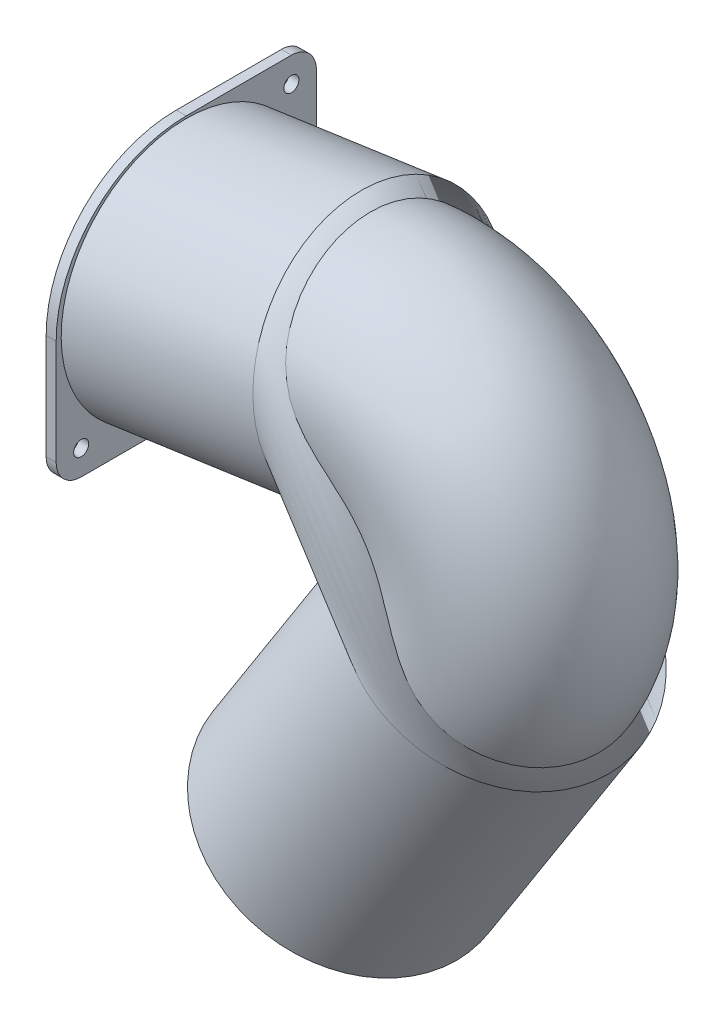
ISO-10303-21;
HEADER;
FILE_DESCRIPTION(('STEP AP214'),'2;1');
FILE_NAME('part.step','',(''),(''),'','','');
FILE_SCHEMA(('AUTOMOTIVE_DESIGN { 1 0 10303 214 1 1 1 1 }'));
ENDSEC;
DATA;
#1=APPLICATION_CONTEXT('core data for automotive mechanical design processes');
#2=APPLICATION_PROTOCOL_DEFINITION('international standard','automotive_design',2000,#1);
#3=PRODUCT_CONTEXT('',#1,'mechanical');
#4=PRODUCT('Part','Part','',(#3));
#5=PRODUCT_RELATED_PRODUCT_CATEGORY('part','',(#4));
#6=PRODUCT_DEFINITION_FORMATION('','',#4);
#7=PRODUCT_DEFINITION_CONTEXT('part definition',#1,'design');
#8=PRODUCT_DEFINITION('design','',#6,#7);
#9=PRODUCT_DEFINITION_SHAPE('','',#8);
#10=(LENGTH_UNIT() NAMED_UNIT(*) SI_UNIT(.MILLI.,.METRE.));
#11=(NAMED_UNIT(*) PLANE_ANGLE_UNIT() SI_UNIT($,.RADIAN.));
#12=(NAMED_UNIT(*) SI_UNIT($,.STERADIAN.) SOLID_ANGLE_UNIT());
#13=UNCERTAINTY_MEASURE_WITH_UNIT(LENGTH_MEASURE(1.E-05),#10,'distance_accuracy_value','');
#14=(GEOMETRIC_REPRESENTATION_CONTEXT(3) GLOBAL_UNCERTAINTY_ASSIGNED_CONTEXT((#13)) GLOBAL_UNIT_ASSIGNED_CONTEXT((#10,
#11,#12)) REPRESENTATION_CONTEXT('',''));
#15=CARTESIAN_POINT('',(0.,0.,0.));
#16=DIRECTION('',(0.,0.,1.));
#17=DIRECTION('',(1.,0.,0.));
#18=AXIS2_PLACEMENT_3D('',#15,#16,#17);
#19=CARTESIAN_POINT('',(146.924356852696,376.875600105168,0.));
#20=DIRECTION('',(0.5387217588722,0.842483748518417,0.));
#21=DIRECTION('',(-0.842483748518417,0.5387217588722,0.));
#22=AXIS2_PLACEMENT_3D('',#19,#20,#21);
#23=PLANE('',#22);
#24=CARTESIAN_POINT('',(146.924356852695,376.875600105168,0.));
#25=DIRECTION('',(0.5387217588722,0.842483748518417,0.));
#26=DIRECTION('',(-0.842483748518417,0.5387217588722,0.));
#27=AXIS2_PLACEMENT_3D('',#24,#25,#26);
#28=CIRCLE('',#27,22.);
#29=CARTESIAN_POINT('',(128.38971438529,388.727478800356,0.));
#30=VERTEX_POINT('',#29);
#31=EDGE_CURVE('E281',#30,#30,#28,.T.);
#32=ORIENTED_EDGE('',*,*,#31,.T.);
#33=EDGE_LOOP('',(#32));
#34=FACE_BOUND('',#33,.T.);
#35=CARTESIAN_POINT('',(146.924356852696,376.875600105168,0.));
#36=DIRECTION('',(0.5387217588722,0.842483748518417,0.));
#37=DIRECTION('',(-0.842483748518417,0.5387217588722,0.));
#38=AXIS2_PLACEMENT_3D('',#35,#36,#37);
#39=CIRCLE('',#38,25.);
#40=CARTESIAN_POINT('',(125.862263139735,390.343644076973,0.));
#41=VERTEX_POINT('',#40);
#42=EDGE_CURVE('E151',#41,#41,#39,.T.);
#43=ORIENTED_EDGE('',*,*,#42,.F.);
#44=EDGE_LOOP('',(#43));
#45=FACE_BOUND('',#44,.T.);
#46=ADVANCED_FACE('F48',(#34,#45),#23,.F.);
#47=CARTESIAN_POINT('',(91.6662023246358,453.640005056301,0.));
#48=DIRECTION('',(0.989712323136892,0.143071721283335,0.));
#49=DIRECTION('',(-0.143071721283335,0.989712323136892,0.));
#50=AXIS2_PLACEMENT_3D('',#47,#48,#49);
#51=CYLINDRICAL_SURFACE('',#50,25.);
#52=CARTESIAN_POINT('',(112.,456.57943640987,0.));
#53=DIRECTION('',(-0.989712323136893,-0.143071721283331,0.));
#54=DIRECTION('',(0.143071721283331,-0.989712323136893,0.));
#55=AXIS2_PLACEMENT_3D('',#52,#53,#54);
#56=CIRCLE('',#55,25.);
#57=CARTESIAN_POINT('',(114.,442.744245021113,-20.7264922077152));
#58=VERTEX_POINT('',#57);
#59=CARTESIAN_POINT('',(114.,442.744245021113,20.7264922077152));
#60=VERTEX_POINT('',#59);
#61=EDGE_CURVE('E284',#58,#60,#56,.T.);
#62=ORIENTED_EDGE('',*,*,#61,.T.);
#63=CARTESIAN_POINT('',(114.,456.868554202866,0.));
#64=DIRECTION('',(1.,0.,0.));
#65=DIRECTION('',(0.,1.,0.));
#66=AXIS2_PLACEMENT_3D('',#63,#64,#65);
#67=ELLIPSE('',#66,25.2598653321427,25.);
#68=EDGE_CURVE('E68',#60,#58,#67,.T.);
#69=ORIENTED_EDGE('',*,*,#68,.T.);
#70=EDGE_LOOP('',(#62,#69));
#71=FACE_BOUND('',#70,.T.);
#72=ADVANCED_FACE('F192',(#71),#51,.T.);
#73=CARTESIAN_POINT('',(112.,456.57943640987,0.));
#74=DIRECTION('',(0.989712323136892,0.143071721283336,0.));
#75=DIRECTION('',(-0.143071721283336,0.989712323136892,0.));
#76=AXIS2_PLACEMENT_3D('',#73,#74,#75);
#77=CYLINDRICAL_SURFACE('',#76,25.);
#78=CARTESIAN_POINT('',(152.567933597811,462.443892123981,0.));
#79=DIRECTION('',(-0.989712323136892,-0.143071721283333,0.));
#80=DIRECTION('',(0.143071721283333,-0.989712323136892,0.));
#81=AXIS2_PLACEMENT_3D('',#78,#79,#80);
#82=CIRCLE('',#81,25.);
#83=CARTESIAN_POINT('',(156.144726629894,437.701084045559,0.));
#84=VERTEX_POINT('',#83);
#85=EDGE_CURVE('E287',#84,#84,#82,.T.);
#86=ORIENTED_EDGE('',*,*,#85,.T.);
#87=EDGE_LOOP('',(#86));
#88=FACE_BOUND('',#87,.T.);
#89=ORIENTED_EDGE('',*,*,#61,.F.);
#90=CARTESIAN_POINT('',(114.,456.868554202866,0.));
#91=DIRECTION('',(1.,0.,0.));
#92=DIRECTION('',(0.,1.,0.));
#93=AXIS2_PLACEMENT_3D('',#90,#91,#92);
#94=ELLIPSE('',#93,25.2598653321427,25.);
#95=EDGE_CURVE('E271',#58,#60,#94,.T.);
#96=ORIENTED_EDGE('',*,*,#95,.T.);
#97=EDGE_LOOP('',(#89,#96));
#98=FACE_BOUND('',#97,.T.);
#99=ADVANCED_FACE('F184',(#88,#98),#77,.T.);
#100=CARTESIAN_POINT('',(156.144726629894,437.701084045559,0.));
#101=DIRECTION('',(0.,0.,-1.));
#102=DIRECTION('',(-1.,0.,0.));
#103=AXIS2_PLACEMENT_3D('',#100,#101,#102);
#104=DEGENERATE_TOROIDAL_SURFACE('',#103,25.,25.,.T.);
#105=CARTESIAN_POINT('',(177.206820342854,424.233040073754,0.));
#106=DIRECTION('',(0.5387217588722,0.842483748518417,0.));
#107=DIRECTION('',(-0.842483748518417,0.5387217588722,0.));
#108=AXIS2_PLACEMENT_3D('',#105,#106,#107);
#109=CIRCLE('',#108,25.);
#110=EDGE_CURVE('E290',#84,#84,#109,.T.);
#111=ORIENTED_EDGE('',*,*,#110,.T.);
#112=ORIENTED_EDGE('',*,*,#85,.F.);
#113=EDGE_LOOP('',(#111,#112));
#114=FACE_BOUND('',#113,.T.);
#115=ADVANCED_FACE('F179',(#114),#104,.T.);
#116=CARTESIAN_POINT('',(177.206820342855,424.233040073754,0.));
#117=DIRECTION('',(-0.538721758872197,-0.842483748518419,0.));
#118=DIRECTION('',(0.842483748518419,-0.538721758872197,0.));
#119=AXIS2_PLACEMENT_3D('',#116,#117,#118);
#120=CYLINDRICAL_SURFACE('',#119,25.);
#121=ORIENTED_EDGE('',*,*,#42,.T.);
#122=EDGE_LOOP('',(#121));
#123=FACE_BOUND('',#122,.T.);
#124=ORIENTED_EDGE('',*,*,#110,.F.);
#125=EDGE_LOOP('',(#124));
#126=FACE_BOUND('',#125,.T.);
#127=ADVANCED_FACE('F175',(#123,#126),#120,.T.);
#128=CARTESIAN_POINT('',(91.6662023246358,453.640005056301,0.));
#129=DIRECTION('',(0.989712323136892,0.143071721283335,0.));
#130=DIRECTION('',(-0.143071721283335,0.989712323136892,0.));
#131=AXIS2_PLACEMENT_3D('',#128,#129,#130);
#132=CYLINDRICAL_SURFACE('',#131,22.);
#133=CARTESIAN_POINT('',(114.,456.868554202866,0.));
#134=DIRECTION('',(1.,0.,0.));
#135=DIRECTION('',(0.,1.,0.));
#136=AXIS2_PLACEMENT_3D('',#133,#134,#135);
#137=ELLIPSE('',#136,22.2286814922856,22.);
#138=CARTESIAN_POINT('',(114.,442.744245021113,16.9878627036032));
#139=VERTEX_POINT('',#138);
#140=CARTESIAN_POINT('',(114.,442.744245021113,-16.9878627036032));
#141=VERTEX_POINT('',#140);
#142=EDGE_CURVE('E255',#139,#141,#137,.T.);
#143=ORIENTED_EDGE('',*,*,#142,.F.);
#144=CARTESIAN_POINT('',(112.,456.57943640987,0.));
#145=DIRECTION('',(0.989712323136892,0.143071721283335,0.));
#146=DIRECTION('',(-0.143071721283335,0.989712323136892,0.));
#147=AXIS2_PLACEMENT_3D('',#144,#145,#146);
#148=CIRCLE('',#147,22.);
#149=EDGE_CURVE('E149',#141,#139,#148,.F.);
#150=ORIENTED_EDGE('',*,*,#149,.F.);
#151=EDGE_LOOP('',(#143,#150));
#152=FACE_BOUND('',#151,.T.);
#153=ADVANCED_FACE('F158',(#152),#132,.F.);
#154=CARTESIAN_POINT('',(112.,456.57943640987,0.));
#155=DIRECTION('',(0.989712323136892,0.143071721283336,0.));
#156=DIRECTION('',(-0.143071721283336,0.989712323136892,0.));
#157=AXIS2_PLACEMENT_3D('',#154,#155,#156);
#158=CYLINDRICAL_SURFACE('',#157,22.);
#159=CARTESIAN_POINT('',(114.,456.868554202866,0.));
#160=DIRECTION('',(1.,0.,0.));
#161=DIRECTION('',(0.,1.,0.));
#162=AXIS2_PLACEMENT_3D('',#159,#160,#161);
#163=ELLIPSE('',#162,22.2286814922856,22.);
#164=CARTESIAN_POINT('',(114.,456.723247877266,-21.9995299554958));
#165=VERTEX_POINT('',#164);
#166=EDGE_CURVE('E12',#141,#165,#163,.T.);
#167=ORIENTED_EDGE('',*,*,#166,.F.);
#168=ORIENTED_EDGE('',*,*,#149,.T.);
#169=CARTESIAN_POINT('',(114.,456.723247877266,21.9995299554751));
#170=VERTEX_POINT('',#169);
#171=EDGE_CURVE('E56',#170,#139,#163,.T.);
#172=ORIENTED_EDGE('',*,*,#171,.F.);
#173=EDGE_CURVE('E55',#165,#170,#163,.T.);
#174=ORIENTED_EDGE('',*,*,#173,.F.);
#175=EDGE_LOOP('',(#167,#168,#172,#174));
#176=FACE_BOUND('',#175,.T.);
#177=CARTESIAN_POINT('',(152.567933597811,462.443892123981,0.));
#178=DIRECTION('',(0.989712323136892,0.143071721283336,0.));
#179=DIRECTION('',(-0.143071721283336,0.989712323136892,0.));
#180=AXIS2_PLACEMENT_3D('',#177,#178,#179);
#181=CIRCLE('',#180,22.);
#182=CARTESIAN_POINT('',(149.420355729577,484.217563232993,0.));
#183=VERTEX_POINT('',#182);
#184=EDGE_CURVE('E275',#183,#183,#181,.F.);
#185=ORIENTED_EDGE('',*,*,#184,.F.);
#186=EDGE_LOOP('',(#185));
#187=FACE_BOUND('',#186,.T.);
#188=ADVANCED_FACE('F146',(#176,#187),#158,.F.);
#189=CARTESIAN_POINT('',(156.144726629894,437.701084045559,0.));
#190=DIRECTION('',(0.,0.,-1.));
#191=DIRECTION('',(-1.,0.,0.));
#192=AXIS2_PLACEMENT_3D('',#189,#190,#191);
#193=TOROIDAL_SURFACE('',#192,25.,22.);
#194=CARTESIAN_POINT('',(177.206820342855,424.233040073754,0.));
#195=DIRECTION('',(0.5387217588722,0.842483748518417,0.));
#196=DIRECTION('',(-0.842483748518417,0.5387217588722,0.));
#197=AXIS2_PLACEMENT_3D('',#194,#195,#196);
#198=CIRCLE('',#197,22.);
#199=CARTESIAN_POINT('',(195.74146281026,412.381161378566,0.));
#200=VERTEX_POINT('',#199);
#201=EDGE_CURVE('E278',#200,#200,#198,.T.);
#202=CARTESIAN_POINT('',(156.144726629894,437.701084045559,0.));
#203=DIRECTION('',(0.,0.,-1.));
#204=DIRECTION('',(-1.,0.,0.));
#205=AXIS2_PLACEMENT_3D('',#202,#203,#204);
#206=CIRCLE('',#205,47.0000000000001);
#207=EDGE_CURVE('',#183,#200,#206,.T.);
#208=ORIENTED_EDGE('',*,*,#184,.T.);
#209=ORIENTED_EDGE('',*,*,#201,.F.);
#210=ORIENTED_EDGE('',*,*,#207,.T.);
#211=ORIENTED_EDGE('',*,*,#207,.F.);
#212=EDGE_LOOP('',(#208,#210,#209,#211));
#213=FACE_BOUND('',#212,.T.);
#214=ADVANCED_FACE('F166',(#213),#193,.F.);
#215=CARTESIAN_POINT('',(177.206820342855,424.233040073754,0.));
#216=DIRECTION('',(-0.538721758872197,-0.842483748518419,0.));
#217=DIRECTION('',(0.842483748518419,-0.538721758872197,0.));
#218=AXIS2_PLACEMENT_3D('',#215,#216,#217);
#219=CYLINDRICAL_SURFACE('',#218,22.);
#220=ORIENTED_EDGE('',*,*,#31,.F.);
#221=EDGE_LOOP('',(#220));
#222=FACE_BOUND('',#221,.T.);
#223=ORIENTED_EDGE('',*,*,#201,.T.);
#224=EDGE_LOOP('',(#223));
#225=FACE_BOUND('',#224,.T.);
#226=ADVANCED_FACE('F155',(#222,#225),#219,.F.);
#227=CARTESIAN_POINT('',(114.,456.57943640987,0.));
#228=DIRECTION('',(1.,0.,0.));
#229=DIRECTION('',(0.,0.,-1.));
#230=AXIS2_PLACEMENT_3D('',#227,#228,#229);
#231=PLANE('',#230);
#232=ORIENTED_EDGE('',*,*,#173,.T.);
#233=CARTESIAN_POINT('',(114.,456.57943640987,0.));
#234=DIRECTION('',(-1.,0.,0.));
#235=DIRECTION('',(0.,0.,1.));
#236=AXIS2_PLACEMENT_3D('',#233,#234,#235);
#237=CIRCLE('',#236,22.);
#238=EDGE_CURVE('E136',#170,#165,#237,.T.);
#239=ORIENTED_EDGE('',*,*,#238,.T.);
#240=EDGE_LOOP('',(#232,#239));
#241=FACE_BOUND('',#240,.T.);
#242=ADVANCED_FACE('F152',(#241),#231,.T.);
#243=CARTESIAN_POINT('',(114.,456.57943640987,0.));
#244=DIRECTION('',(-1.,0.,0.));
#245=DIRECTION('',(0.,0.,1.));
#246=AXIS2_PLACEMENT_3D('',#243,#244,#245);
#247=CYLINDRICAL_SURFACE('',#246,26.);
#248=CARTESIAN_POINT('',(112.,456.57943640987,0.));
#249=DIRECTION('',(-1.,0.,0.));
#250=DIRECTION('',(0.,0.,-1.));
#251=AXIS2_PLACEMENT_3D('',#248,#249,#250);
#252=CIRCLE('',#251,26.);
#253=CARTESIAN_POINT('',(112.,456.57943640987,-26.));
#254=VERTEX_POINT('',#253);
#255=CARTESIAN_POINT('',(112.,430.57943640987,0.));
#256=VERTEX_POINT('',#255);
#257=EDGE_CURVE('E493',#254,#256,#252,.T.);
#258=ORIENTED_EDGE('',*,*,#257,.F.);
#259=DIRECTION('',(-1.,0.,0.));
#260=VECTOR('',#259,1.);
#261=CARTESIAN_POINT('',(114.,456.57943640987,-26.));
#262=LINE('',#261,#260);
#263=CARTESIAN_POINT('',(114.,456.57943640987,-26.));
#264=VERTEX_POINT('',#263);
#265=EDGE_CURVE('E239',#264,#254,#262,.T.);
#266=ORIENTED_EDGE('',*,*,#265,.F.);
#267=CARTESIAN_POINT('',(114.,456.57943640987,0.));
#268=DIRECTION('',(-1.,0.,0.));
#269=DIRECTION('',(0.,0.,-1.));
#270=AXIS2_PLACEMENT_3D('',#267,#268,#269);
#271=CIRCLE('',#270,26.);
#272=CARTESIAN_POINT('',(114.,430.57943640987,0.));
#273=VERTEX_POINT('',#272);
#274=EDGE_CURVE('E244',#264,#273,#271,.T.);
#275=ORIENTED_EDGE('',*,*,#274,.T.);
#276=DIRECTION('',(-1.,0.,0.));
#277=VECTOR('',#276,1.);
#278=CARTESIAN_POINT('',(114.,430.57943640987,0.));
#279=LINE('',#278,#277);
#280=EDGE_CURVE('E267',#273,#256,#279,.T.);
#281=ORIENTED_EDGE('',*,*,#280,.T.);
#282=EDGE_LOOP('',(#258,#266,#275,#281));
#283=FACE_BOUND('',#282,.T.);
#284=ADVANCED_FACE('F154',(#283),#247,.T.);
#285=CARTESIAN_POINT('',(114.,456.57943640987,-26.));
#286=DIRECTION('',(0.,0.,-1.));
#287=DIRECTION('',(-1.,0.,0.));
#288=AXIS2_PLACEMENT_3D('',#285,#286,#287);
#289=PLANE('',#288);
#290=DIRECTION('',(0.,-1.,0.));
#291=VECTOR('',#290,1.);
#292=CARTESIAN_POINT('',(112.,456.57943640987,-26.));
#293=LINE('',#292,#291);
#294=CARTESIAN_POINT('',(112.,477.57943640987,-26.));
#295=VERTEX_POINT('',#294);
#296=EDGE_CURVE('E235',#295,#254,#293,.T.);
#297=ORIENTED_EDGE('',*,*,#296,.F.);
#298=DIRECTION('',(-1.,0.,0.));
#299=VECTOR('',#298,1.);
#300=CARTESIAN_POINT('',(114.,477.57943640987,-26.));
#301=LINE('',#300,#299);
#302=CARTESIAN_POINT('',(114.,477.57943640987,-26.));
#303=VERTEX_POINT('',#302);
#304=EDGE_CURVE('E237',#303,#295,#301,.T.);
#305=ORIENTED_EDGE('',*,*,#304,.F.);
#306=DIRECTION('',(0.,-1.,0.));
#307=VECTOR('',#306,1.);
#308=CARTESIAN_POINT('',(114.,456.57943640987,-26.));
#309=LINE('',#308,#307);
#310=EDGE_CURVE('E269',#303,#264,#309,.T.);
#311=ORIENTED_EDGE('',*,*,#310,.T.);
#312=ORIENTED_EDGE('',*,*,#265,.T.);
#313=EDGE_LOOP('',(#297,#305,#311,#312));
#314=FACE_BOUND('',#313,.T.);
#315=ADVANCED_FACE('F163',(#314),#289,.T.);
#316=CARTESIAN_POINT('',(114.,477.57943640987,-21.));
#317=DIRECTION('',(-1.,0.,0.));
#318=DIRECTION('',(0.,0.,1.));
#319=AXIS2_PLACEMENT_3D('',#316,#317,#318);
#320=CYLINDRICAL_SURFACE('',#319,5.);
#321=CARTESIAN_POINT('',(112.,477.57943640987,-21.));
#322=DIRECTION('',(-1.,0.,0.));
#323=DIRECTION('',(0.,0.,-1.));
#324=AXIS2_PLACEMENT_3D('',#321,#322,#323);
#325=CIRCLE('',#324,5.);
#326=CARTESIAN_POINT('',(112.,482.57943640987,-21.));
#327=VERTEX_POINT('',#326);
#328=EDGE_CURVE('E245',#327,#295,#325,.T.);
#329=ORIENTED_EDGE('',*,*,#328,.F.);
#330=DIRECTION('',(-1.,0.,0.));
#331=VECTOR('',#330,1.);
#332=CARTESIAN_POINT('',(114.,482.57943640987,-21.));
#333=LINE('',#332,#331);
#334=CARTESIAN_POINT('',(114.,482.57943640987,-21.));
#335=VERTEX_POINT('',#334);
#336=EDGE_CURVE('E257',#335,#327,#333,.T.);
#337=ORIENTED_EDGE('',*,*,#336,.F.);
#338=CARTESIAN_POINT('',(114.,477.57943640987,-21.));
#339=DIRECTION('',(-1.,0.,0.));
#340=DIRECTION('',(0.,0.,-1.));
#341=AXIS2_PLACEMENT_3D('',#338,#339,#340);
#342=CIRCLE('',#341,5.);
#343=EDGE_CURVE('E510',#335,#303,#342,.T.);
#344=ORIENTED_EDGE('',*,*,#343,.T.);
#345=ORIENTED_EDGE('',*,*,#304,.T.);
#346=EDGE_LOOP('',(#329,#337,#344,#345));
#347=FACE_BOUND('',#346,.T.);
#348=ADVANCED_FACE('F225',(#347),#320,.T.);
#349=CARTESIAN_POINT('',(114.,482.57943640987,-21.));
#350=DIRECTION('',(0.,1.,0.));
#351=DIRECTION('',(0.,0.,1.));
#352=AXIS2_PLACEMENT_3D('',#349,#350,#351);
#353=PLANE('',#352);
#354=DIRECTION('',(0.,0.,-1.));
#355=VECTOR('',#354,1.);
#356=CARTESIAN_POINT('',(112.,482.57943640987,-21.));
#357=LINE('',#356,#355);
#358=CARTESIAN_POINT('',(112.,482.57943640987,0.));
#359=VERTEX_POINT('',#358);
#360=EDGE_CURVE('E250',#359,#327,#357,.T.);
#361=ORIENTED_EDGE('',*,*,#360,.F.);
#362=DIRECTION('',(-1.,0.,0.));
#363=VECTOR('',#362,1.);
#364=CARTESIAN_POINT('',(114.,482.57943640987,0.));
#365=LINE('',#364,#363);
#366=CARTESIAN_POINT('',(114.,482.57943640987,0.));
#367=VERTEX_POINT('',#366);
#368=EDGE_CURVE('E259',#367,#359,#365,.T.);
#369=ORIENTED_EDGE('',*,*,#368,.F.);
#370=DIRECTION('',(0.,0.,-1.));
#371=VECTOR('',#370,1.);
#372=CARTESIAN_POINT('',(114.,482.57943640987,-21.));
#373=LINE('',#372,#371);
#374=EDGE_CURVE('E507',#367,#335,#373,.T.);
#375=ORIENTED_EDGE('',*,*,#374,.T.);
#376=ORIENTED_EDGE('',*,*,#336,.T.);
#377=EDGE_LOOP('',(#361,#369,#375,#376));
#378=FACE_BOUND('',#377,.T.);
#379=ADVANCED_FACE('F221',(#378),#353,.T.);
#380=CARTESIAN_POINT('',(114.,456.57943640987,0.));
#381=DIRECTION('',(-1.,0.,0.));
#382=DIRECTION('',(0.,0.,1.));
#383=AXIS2_PLACEMENT_3D('',#380,#381,#382);
#384=CYLINDRICAL_SURFACE('',#383,26.);
#385=CARTESIAN_POINT('',(112.,456.57943640987,0.));
#386=DIRECTION('',(-1.,0.,0.));
#387=DIRECTION('',(0.,0.,-1.));
#388=AXIS2_PLACEMENT_3D('',#385,#386,#387);
#389=CIRCLE('',#388,26.);
#390=CARTESIAN_POINT('',(112.,456.57943640987,26.));
#391=VERTEX_POINT('',#390);
#392=EDGE_CURVE('E523',#391,#359,#389,.T.);
#393=ORIENTED_EDGE('',*,*,#392,.F.);
#394=DIRECTION('',(-1.,0.,0.));
#395=VECTOR('',#394,1.);
#396=CARTESIAN_POINT('',(114.,456.57943640987,26.));
#397=LINE('',#396,#395);
#398=CARTESIAN_POINT('',(114.,456.57943640987,26.));
#399=VERTEX_POINT('',#398);
#400=EDGE_CURVE('E261',#399,#391,#397,.T.);
#401=ORIENTED_EDGE('',*,*,#400,.F.);
#402=CARTESIAN_POINT('',(114.,456.57943640987,0.));
#403=DIRECTION('',(-1.,0.,0.));
#404=DIRECTION('',(0.,0.,-1.));
#405=AXIS2_PLACEMENT_3D('',#402,#403,#404);
#406=CIRCLE('',#405,26.);
#407=EDGE_CURVE('E504',#399,#367,#406,.T.);
#408=ORIENTED_EDGE('',*,*,#407,.T.);
#409=ORIENTED_EDGE('',*,*,#368,.T.);
#410=EDGE_LOOP('',(#393,#401,#408,#409));
#411=FACE_BOUND('',#410,.T.);
#412=ADVANCED_FACE('F217',(#411),#384,.T.);
#413=CARTESIAN_POINT('',(114.,435.57943640987,26.));
#414=DIRECTION('',(0.,0.,1.));
#415=DIRECTION('',(1.,0.,0.));
#416=AXIS2_PLACEMENT_3D('',#413,#414,#415);
#417=PLANE('',#416);
#418=DIRECTION('',(0.,1.,0.));
#419=VECTOR('',#418,1.);
#420=CARTESIAN_POINT('',(112.,435.57943640987,26.));
#421=LINE('',#420,#419);
#422=CARTESIAN_POINT('',(112.,435.57943640987,26.));
#423=VERTEX_POINT('',#422);
#424=EDGE_CURVE('E520',#423,#391,#421,.T.);
#425=ORIENTED_EDGE('',*,*,#424,.F.);
#426=DIRECTION('',(-1.,0.,0.));
#427=VECTOR('',#426,1.);
#428=CARTESIAN_POINT('',(114.,435.57943640987,26.));
#429=LINE('',#428,#427);
#430=CARTESIAN_POINT('',(114.,435.57943640987,26.));
#431=VERTEX_POINT('',#430);
#432=EDGE_CURVE('E263',#431,#423,#429,.T.);
#433=ORIENTED_EDGE('',*,*,#432,.F.);
#434=DIRECTION('',(0.,1.,0.));
#435=VECTOR('',#434,1.);
#436=CARTESIAN_POINT('',(114.,435.57943640987,26.));
#437=LINE('',#436,#435);
#438=EDGE_CURVE('E501',#431,#399,#437,.T.);
#439=ORIENTED_EDGE('',*,*,#438,.T.);
#440=ORIENTED_EDGE('',*,*,#400,.T.);
#441=EDGE_LOOP('',(#425,#433,#439,#440));
#442=FACE_BOUND('',#441,.T.);
#443=ADVANCED_FACE('F213',(#442),#417,.T.);
#444=CARTESIAN_POINT('',(114.,435.57943640987,21.));
#445=DIRECTION('',(-1.,0.,0.));
#446=DIRECTION('',(0.,0.,1.));
#447=AXIS2_PLACEMENT_3D('',#444,#445,#446);
#448=CYLINDRICAL_SURFACE('',#447,5.);
#449=CARTESIAN_POINT('',(112.,435.57943640987,21.));
#450=DIRECTION('',(-1.,0.,0.));
#451=DIRECTION('',(0.,0.,1.));
#452=AXIS2_PLACEMENT_3D('',#449,#450,#451);
#453=CIRCLE('',#452,5.);
#454=CARTESIAN_POINT('',(112.,430.57943640987,21.));
#455=VERTEX_POINT('',#454);
#456=EDGE_CURVE('E517',#455,#423,#453,.T.);
#457=ORIENTED_EDGE('',*,*,#456,.F.);
#458=DIRECTION('',(-1.,0.,0.));
#459=VECTOR('',#458,1.);
#460=CARTESIAN_POINT('',(114.,430.57943640987,21.));
#461=LINE('',#460,#459);
#462=CARTESIAN_POINT('',(114.,430.57943640987,21.));
#463=VERTEX_POINT('',#462);
#464=EDGE_CURVE('E265',#463,#455,#461,.T.);
#465=ORIENTED_EDGE('',*,*,#464,.F.);
#466=CARTESIAN_POINT('',(114.,435.57943640987,21.));
#467=DIRECTION('',(-1.,0.,0.));
#468=DIRECTION('',(0.,0.,1.));
#469=AXIS2_PLACEMENT_3D('',#466,#467,#468);
#470=CIRCLE('',#469,5.);
#471=EDGE_CURVE('E498',#463,#431,#470,.T.);
#472=ORIENTED_EDGE('',*,*,#471,.T.);
#473=ORIENTED_EDGE('',*,*,#432,.T.);
#474=EDGE_LOOP('',(#457,#465,#472,#473));
#475=FACE_BOUND('',#474,.T.);
#476=ADVANCED_FACE('F209',(#475),#448,.T.);
#477=CARTESIAN_POINT('',(114.,430.57943640987,0.));
#478=DIRECTION('',(0.,-1.,0.));
#479=DIRECTION('',(0.,0.,-1.));
#480=AXIS2_PLACEMENT_3D('',#477,#478,#479);
#481=PLANE('',#480);
#482=DIRECTION('',(0.,0.,1.));
#483=VECTOR('',#482,1.);
#484=CARTESIAN_POINT('',(112.,430.57943640987,0.));
#485=LINE('',#484,#483);
#486=EDGE_CURVE('E514',#256,#455,#485,.T.);
#487=ORIENTED_EDGE('',*,*,#486,.F.);
#488=ORIENTED_EDGE('',*,*,#280,.F.);
#489=DIRECTION('',(0.,0.,1.));
#490=VECTOR('',#489,1.);
#491=CARTESIAN_POINT('',(114.,430.57943640987,0.));
#492=LINE('',#491,#490);
#493=EDGE_CURVE('E248',#273,#463,#492,.T.);
#494=ORIENTED_EDGE('',*,*,#493,.T.);
#495=ORIENTED_EDGE('',*,*,#464,.T.);
#496=EDGE_LOOP('',(#487,#488,#494,#495));
#497=FACE_BOUND('',#496,.T.);
#498=ADVANCED_FACE('F173',(#497),#481,.T.);
#499=ORIENTED_EDGE('',*,*,#68,.F.);
#500=ORIENTED_EDGE('',*,*,#95,.F.);
#501=EDGE_LOOP('',(#499,#500));
#502=FACE_BOUND('',#501,.T.);
#503=CARTESIAN_POINT('',(114.,477.57943640987,-21.));
#504=DIRECTION('',(-1.,0.,0.));
#505=DIRECTION('',(0.,0.,1.));
#506=AXIS2_PLACEMENT_3D('',#503,#504,#505);
#507=CIRCLE('',#506,1.5);
#508=CARTESIAN_POINT('',(114.,477.57943640987,-19.5));
#509=VERTEX_POINT('',#508);
#510=EDGE_CURVE('E481',#509,#509,#507,.T.);
#511=ORIENTED_EDGE('',*,*,#510,.T.);
#512=EDGE_LOOP('',(#511));
#513=FACE_BOUND('',#512,.T.);
#514=CARTESIAN_POINT('',(114.,435.57943640987,21.));
#515=DIRECTION('',(-1.,0.,0.));
#516=DIRECTION('',(0.,0.,1.));
#517=AXIS2_PLACEMENT_3D('',#514,#515,#516);
#518=CIRCLE('',#517,1.5);
#519=CARTESIAN_POINT('',(114.,435.57943640987,22.5));
#520=VERTEX_POINT('',#519);
#521=EDGE_CURVE('E490',#520,#520,#518,.T.);
#522=ORIENTED_EDGE('',*,*,#521,.T.);
#523=EDGE_LOOP('',(#522));
#524=FACE_BOUND('',#523,.T.);
#525=ORIENTED_EDGE('',*,*,#274,.F.);
#526=ORIENTED_EDGE('',*,*,#310,.F.);
#527=ORIENTED_EDGE('',*,*,#343,.F.);
#528=ORIENTED_EDGE('',*,*,#374,.F.);
#529=ORIENTED_EDGE('',*,*,#407,.F.);
#530=ORIENTED_EDGE('',*,*,#438,.F.);
#531=ORIENTED_EDGE('',*,*,#471,.F.);
#532=ORIENTED_EDGE('',*,*,#493,.F.);
#533=EDGE_LOOP('',(#525,#526,#527,#528,#529,#530,#531,#532));
#534=FACE_BOUND('',#533,.T.);
#535=ADVANCED_FACE('F157',(#502,#513,#524,#534),#231,.T.);
#536=CARTESIAN_POINT('',(114.,435.57943640987,21.));
#537=DIRECTION('',(-1.,0.,0.));
#538=DIRECTION('',(0.,0.,1.));
#539=AXIS2_PLACEMENT_3D('',#536,#537,#538);
#540=CYLINDRICAL_SURFACE('',#539,1.5);
#541=ORIENTED_EDGE('',*,*,#521,.F.);
#542=EDGE_LOOP('',(#541));
#543=FACE_BOUND('',#542,.T.);
#544=CARTESIAN_POINT('',(112.,435.57943640987,21.));
#545=DIRECTION('',(-1.,0.,0.));
#546=DIRECTION('',(0.,0.,1.));
#547=AXIS2_PLACEMENT_3D('',#544,#545,#546);
#548=CIRCLE('',#547,1.5);
#549=CARTESIAN_POINT('',(112.,435.57943640987,22.5));
#550=VERTEX_POINT('',#549);
#551=EDGE_CURVE('E486',#550,#550,#548,.T.);
#552=ORIENTED_EDGE('',*,*,#551,.T.);
#553=EDGE_LOOP('',(#552));
#554=FACE_BOUND('',#553,.T.);
#555=ADVANCED_FACE('F172',(#543,#554),#540,.F.);
#556=CARTESIAN_POINT('',(114.,477.57943640987,-21.));
#557=DIRECTION('',(-1.,0.,0.));
#558=DIRECTION('',(0.,0.,1.));
#559=AXIS2_PLACEMENT_3D('',#556,#557,#558);
#560=CYLINDRICAL_SURFACE('',#559,1.5);
#561=ORIENTED_EDGE('',*,*,#510,.F.);
#562=EDGE_LOOP('',(#561));
#563=FACE_BOUND('',#562,.T.);
#564=CARTESIAN_POINT('',(112.,477.57943640987,-21.));
#565=DIRECTION('',(-1.,0.,0.));
#566=DIRECTION('',(0.,0.,1.));
#567=AXIS2_PLACEMENT_3D('',#564,#565,#566);
#568=CIRCLE('',#567,1.5);
#569=CARTESIAN_POINT('',(112.,477.57943640987,-19.5));
#570=VERTEX_POINT('',#569);
#571=EDGE_CURVE('E144',#570,#570,#568,.T.);
#572=ORIENTED_EDGE('',*,*,#571,.T.);
#573=EDGE_LOOP('',(#572));
#574=FACE_BOUND('',#573,.T.);
#575=ADVANCED_FACE('F199',(#563,#574),#560,.F.);
#576=CARTESIAN_POINT('',(112.,481.839301742012,-25.));
#577=DIRECTION('',(1.,0.,0.));
#578=DIRECTION('',(0.,0.,-1.));
#579=AXIS2_PLACEMENT_3D('',#576,#577,#578);
#580=PLANE('',#579);
#581=CARTESIAN_POINT('',(112.,456.57943640987,0.));
#582=DIRECTION('',(-1.,0.,0.));
#583=DIRECTION('',(0.,0.,1.));
#584=AXIS2_PLACEMENT_3D('',#581,#582,#583);
#585=CIRCLE('',#584,22.);
#586=CARTESIAN_POINT('',(112.,456.57943640987,22.));
#587=VERTEX_POINT('',#586);
#588=EDGE_CURVE('E137',#587,#587,#585,.T.);
#589=ORIENTED_EDGE('',*,*,#588,.F.);
#590=EDGE_LOOP('',(#589));
#591=FACE_BOUND('',#590,.T.);
#592=ORIENTED_EDGE('',*,*,#571,.F.);
#593=EDGE_LOOP('',(#592));
#594=FACE_BOUND('',#593,.T.);
#595=ORIENTED_EDGE('',*,*,#551,.F.);
#596=EDGE_LOOP('',(#595));
#597=FACE_BOUND('',#596,.T.);
#598=ORIENTED_EDGE('',*,*,#257,.T.);
#599=ORIENTED_EDGE('',*,*,#486,.T.);
#600=ORIENTED_EDGE('',*,*,#456,.T.);
#601=ORIENTED_EDGE('',*,*,#424,.T.);
#602=ORIENTED_EDGE('',*,*,#392,.T.);
#603=ORIENTED_EDGE('',*,*,#360,.T.);
#604=ORIENTED_EDGE('',*,*,#328,.T.);
#605=ORIENTED_EDGE('',*,*,#296,.T.);
#606=EDGE_LOOP('',(#598,#599,#600,#601,#602,#603,#604,#605));
#607=FACE_BOUND('',#606,.T.);
#608=ADVANCED_FACE('F197',(#591,#594,#597,#607),#580,.F.);
#609=CARTESIAN_POINT('',(114.,456.57943640987,0.));
#610=DIRECTION('',(-1.,0.,0.));
#611=DIRECTION('',(0.,0.,1.));
#612=AXIS2_PLACEMENT_3D('',#609,#610,#611);
#613=PLANE('',#612);
#614=ORIENTED_EDGE('',*,*,#166,.T.);
#615=EDGE_CURVE('E62',#165,#170,#237,.T.);
#616=ORIENTED_EDGE('',*,*,#615,.T.);
#617=ORIENTED_EDGE('',*,*,#171,.T.);
#618=ORIENTED_EDGE('',*,*,#142,.T.);
#619=EDGE_LOOP('',(#614,#616,#617,#618));
#620=FACE_BOUND('',#619,.T.);
#621=ADVANCED_FACE('F131',(#620),#613,.T.);
#622=CARTESIAN_POINT('',(114.,456.57943640987,0.));
#623=DIRECTION('',(-1.,0.,0.));
#624=DIRECTION('',(0.,0.,1.));
#625=AXIS2_PLACEMENT_3D('',#622,#623,#624);
#626=CYLINDRICAL_SURFACE('',#625,22.);
#627=ORIENTED_EDGE('',*,*,#238,.F.);
#628=ORIENTED_EDGE('',*,*,#615,.F.);
#629=EDGE_LOOP('',(#627,#628));
#630=FACE_BOUND('',#629,.T.);
#631=ORIENTED_EDGE('',*,*,#588,.T.);
#632=EDGE_LOOP('',(#631));
#633=FACE_BOUND('',#632,.T.);
#634=ADVANCED_FACE('F139',(#630,#633),#626,.F.);
#635=CLOSED_SHELL('',(#46,#72,#99,#115,#127,#153,#188,#214,#226,#242,#284,#315,#348,#379,#412,
#443,#476,#498,#535,#555,#575,#608,#621,#634));
#636=MANIFOLD_SOLID_BREP('B2',#635);
#637=ADVANCED_BREP_SHAPE_REPRESENTATION('',(#18,#636),#14);
#638=SHAPE_DEFINITION_REPRESENTATION(#9,#637);
ENDSEC;
END-ISO-10303-21;
